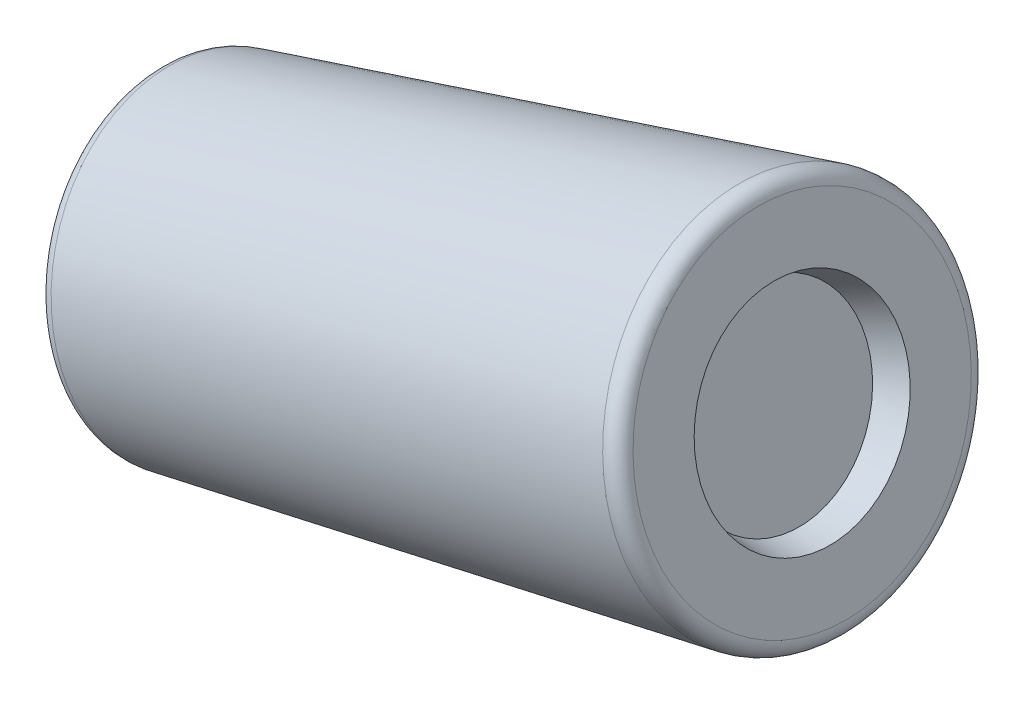
ISO-10303-21;
HEADER;
FILE_DESCRIPTION(('STEP AP214'),'2;1');
FILE_NAME('part.step','',(''),(''),'','','');
FILE_SCHEMA(('AUTOMOTIVE_DESIGN { 1 0 10303 214 1 1 1 1 }'));
ENDSEC;
DATA;
#1=APPLICATION_CONTEXT('core data for automotive mechanical design processes');
#2=APPLICATION_PROTOCOL_DEFINITION('international standard','automotive_design',2000,#1);
#3=PRODUCT_CONTEXT('',#1,'mechanical');
#4=PRODUCT('Part','Part','',(#3));
#5=PRODUCT_RELATED_PRODUCT_CATEGORY('part','',(#4));
#6=PRODUCT_DEFINITION_FORMATION('','',#4);
#7=PRODUCT_DEFINITION_CONTEXT('part definition',#1,'design');
#8=PRODUCT_DEFINITION('design','',#6,#7);
#9=PRODUCT_DEFINITION_SHAPE('','',#8);
#10=(LENGTH_UNIT() NAMED_UNIT(*) SI_UNIT(.MILLI.,.METRE.));
#11=(NAMED_UNIT(*) PLANE_ANGLE_UNIT() SI_UNIT($,.RADIAN.));
#12=(NAMED_UNIT(*) SI_UNIT($,.STERADIAN.) SOLID_ANGLE_UNIT());
#13=UNCERTAINTY_MEASURE_WITH_UNIT(LENGTH_MEASURE(1.E-05),#10,'distance_accuracy_value','');
#14=(GEOMETRIC_REPRESENTATION_CONTEXT(3) GLOBAL_UNCERTAINTY_ASSIGNED_CONTEXT((#13)) GLOBAL_UNIT_ASSIGNED_CONTEXT((#10,
#11,#12)) REPRESENTATION_CONTEXT('',''));
#15=CARTESIAN_POINT('',(0.,0.,0.));
#16=DIRECTION('',(0.,0.,1.));
#17=DIRECTION('',(1.,0.,0.));
#18=AXIS2_PLACEMENT_3D('',#15,#16,#17);
#19=CARTESIAN_POINT('',(-2.86801151343943,17.3181483474219,0.));
#20=DIRECTION('',(-0.963511540477174,-0.267666791678202,0.));
#21=DIRECTION('',(0.267666791678202,-0.963511540477174,0.));
#22=AXIS2_PLACEMENT_3D('',#19,#20,#21);
#23=PLANE('',#22);
#24=CARTESIAN_POINT('',(-3.67101188847403,20.2086829688534,0.));
#25=DIRECTION('',(-0.963511540477174,-0.267666791678202,0.));
#26=DIRECTION('',(0.267666791678202,-0.963511540477174,0.));
#27=AXIS2_PLACEMENT_3D('',#24,#25,#26);
#28=CIRCLE('',#27,2.73986886156946);
#29=CARTESIAN_POINT('',(-2.93763998067873,17.5687877013372,0.));
#30=VERTEX_POINT('',#29);
#31=EDGE_CURVE('E11',#30,#30,#28,.F.);
#32=ORIENTED_EDGE('',*,*,#31,.T.);
#33=EDGE_LOOP('',(#32));
#34=FACE_BOUND('',#33,.T.);
#35=CARTESIAN_POINT('',(-3.67101188847403,20.2086829688534,0.));
#36=DIRECTION('',(0.963511540477174,0.267666791678202,0.));
#37=DIRECTION('',(-0.267666791678202,0.963511540477174,0.));
#38=AXIS2_PLACEMENT_3D('',#35,#36,#37);
#39=CIRCLE('',#38,1.75);
#40=CARTESIAN_POINT('',(-4.13942877391089,21.8948281646884,0.));
#41=VERTEX_POINT('',#40);
#42=EDGE_CURVE('E80',#41,#41,#39,.T.);
#43=ORIENTED_EDGE('',*,*,#42,.F.);
#44=EDGE_LOOP('',(#43));
#45=FACE_BOUND('',#44,.T.);
#46=ADVANCED_FACE('F33',(#34,#45),#23,.F.);
#47=CARTESIAN_POINT('',(-13.7241476680149,17.4158875664419,0.));
#48=DIRECTION('',(-0.963511540477174,-0.267666791678202,0.));
#49=DIRECTION('',(0.267666791678202,-0.963511540477174,0.));
#50=AXIS2_PLACEMENT_3D('',#47,#48,#49);
#51=CONICAL_SURFACE('',#50,0.,1.53108180624639);
#52=CARTESIAN_POINT('',(-13.8134114550168,17.3910897820085,0.));
#53=DIRECTION('',(0.963511540477174,0.267666791678202,0.));
#54=DIRECTION('',(-0.267666791678202,0.963511540477174,0.));
#55=AXIS2_PLACEMENT_3D('',#52,#53,#54);
#56=CIRCLE('',#55,2.33152807659627);
#57=CARTESIAN_POINT('',(-14.437484094987,19.6375439907556,0.));
#58=VERTEX_POINT('',#57);
#59=EDGE_CURVE('E39',#58,#58,#56,.F.);
#60=ORIENTED_EDGE('',*,*,#59,.T.);
#61=EDGE_LOOP('',(#60));
#62=FACE_BOUND('',#61,.T.);
#63=CARTESIAN_POINT('',(-13.7241476680149,17.4158875664419,0.));
#64=VERTEX_POINT('',#63);
#65=VERTEX_LOOP('',#64);
#66=FACE_BOUND('',#65,.T.);
#67=ADVANCED_FACE('F42',(#62,#66),#51,.F.);
#68=CARTESIAN_POINT('',(-13.8229752901902,17.3884329159831,0.));
#69=DIRECTION('',(0.963511540477174,0.267666791678202,0.));
#70=DIRECTION('',(-0.267666791678202,0.963511540477174,0.));
#71=AXIS2_PLACEMENT_3D('',#68,#69,#70);
#72=CONICAL_SURFACE('',#71,2.58133094711561,0.0397145205485045);
#73=CARTESIAN_POINT('',(-13.5822873416005,17.455296848887,0.));
#74=DIRECTION('',(-0.963511540477174,-0.267666791678202,0.));
#75=DIRECTION('',(0.267666791678202,-0.963511540477174,0.));
#76=AXIS2_PLACEMENT_3D('',#73,#74,#75);
#77=CIRCLE('',#76,2.59125696748125);
#78=CARTESIAN_POINT('',(-12.888693902701,14.9585908563769,0.));
#79=VERTEX_POINT('',#78);
#80=EDGE_CURVE('E88',#79,#79,#77,.F.);
#81=ORIENTED_EDGE('',*,*,#80,.T.);
#82=EDGE_LOOP('',(#81));
#83=FACE_BOUND('',#82,.T.);
#84=CARTESIAN_POINT('',(-3.92145360876664,20.1391094049084,0.));
#85=DIRECTION('',(-0.963511540477174,-0.267666791678202,0.));
#86=DIRECTION('',(0.267666791678202,-0.963511540477174,0.));
#87=AXIS2_PLACEMENT_3D('',#84,#85,#86);
#88=CIRCLE('',#87,2.9896717320888);
#89=CARTESIAN_POINT('',(-3.12121776806742,17.2585261888025,0.));
#90=VERTEX_POINT('',#89);
#91=EDGE_CURVE('E75',#90,#90,#88,.T.);
#92=ORIENTED_EDGE('',*,*,#91,.T.);
#93=EDGE_LOOP('',(#92));
#94=FACE_BOUND('',#93,.T.);
#95=ADVANCED_FACE('F44',(#83,#94),#72,.T.);
#96=CARTESIAN_POINT('',(-3.67101188847403,20.2086829688534,0.));
#97=DIRECTION('',(0.963511540477174,0.267666791678202,0.));
#98=DIRECTION('',(-0.267666791678202,0.963511540477174,0.));
#99=AXIS2_PLACEMENT_3D('',#96,#97,#98);
#100=CONICAL_SURFACE('',#99,1.75,0.279252680319093);
#101=CARTESIAN_POINT('',(-4.15276765871262,20.0748495730143,0.));
#102=DIRECTION('',(0.963511540477174,0.267666791678202,0.));
#103=DIRECTION('',(-0.267666791678202,0.963511540477174,0.));
#104=AXIS2_PLACEMENT_3D('',#101,#102,#103);
#105=CIRCLE('',#104,1.6066273071206);
#106=CARTESIAN_POINT('',(-4.58280843543218,21.6228535246707,0.));
#107=VERTEX_POINT('',#106);
#108=EDGE_CURVE('E82',#107,#107,#105,.T.);
#109=ORIENTED_EDGE('',*,*,#108,.F.);
#110=EDGE_LOOP('',(#109));
#111=FACE_BOUND('',#110,.T.);
#112=ORIENTED_EDGE('',*,*,#42,.T.);
#113=EDGE_LOOP('',(#112));
#114=FACE_BOUND('',#113,.T.);
#115=ADVANCED_FACE('F50',(#111,#114),#100,.F.);
#116=CARTESIAN_POINT('',(-4.15276765871262,20.0748495730143,0.));
#117=DIRECTION('',(0.963511540477174,0.267666791678202,0.));
#118=DIRECTION('',(-0.267666791678202,0.963511540477174,0.));
#119=AXIS2_PLACEMENT_3D('',#116,#117,#118);
#120=PLANE('',#119);
#121=ORIENTED_EDGE('',*,*,#108,.T.);
#122=EDGE_LOOP('',(#121));
#123=FACE_BOUND('',#122,.T.);
#124=ADVANCED_FACE('F58',(#123),#120,.T.);
#125=CARTESIAN_POINT('',(-13.5727235064271,17.4579537149124,0.));
#126=DIRECTION('',(-0.963511540477174,-0.267666791678202,0.));
#127=DIRECTION('',(0.267666791678202,-0.963511540477174,0.));
#128=AXIS2_PLACEMENT_3D('',#125,#126,#127);
#129=TOROIDAL_SURFACE('',#128,2.34145409696192,0.25);
#130=ORIENTED_EDGE('',*,*,#59,.F.);
#131=EDGE_LOOP('',(#130));
#132=FACE_BOUND('',#131,.T.);
#133=ORIENTED_EDGE('',*,*,#80,.F.);
#134=EDGE_LOOP('',(#133));
#135=FACE_BOUND('',#134,.T.);
#136=ADVANCED_FACE('F62',(#132,#135),#129,.T.);
#137=CARTESIAN_POINT('',(-3.91188977359333,20.1417662709338,0.));
#138=DIRECTION('',(-0.963511540477174,-0.267666791678202,0.));
#139=DIRECTION('',(0.267666791678202,-0.963511540477174,0.));
#140=AXIS2_PLACEMENT_3D('',#137,#138,#139);
#141=TOROIDAL_SURFACE('',#140,2.73986886156946,0.25);
#142=ORIENTED_EDGE('',*,*,#91,.F.);
#143=EDGE_LOOP('',(#142));
#144=FACE_BOUND('',#143,.T.);
#145=ORIENTED_EDGE('',*,*,#31,.F.);
#146=EDGE_LOOP('',(#145));
#147=FACE_BOUND('',#146,.T.);
#148=ADVANCED_FACE('F66',(#144,#147),#141,.T.);
#149=CLOSED_SHELL('',(#46,#67,#95,#115,#124,#136,#148));
#150=MANIFOLD_SOLID_BREP('B2',#149);
#151=ADVANCED_BREP_SHAPE_REPRESENTATION('',(#18,#150),#14);
#152=SHAPE_DEFINITION_REPRESENTATION(#9,#151);
ENDSEC;
END-ISO-10303-21;
